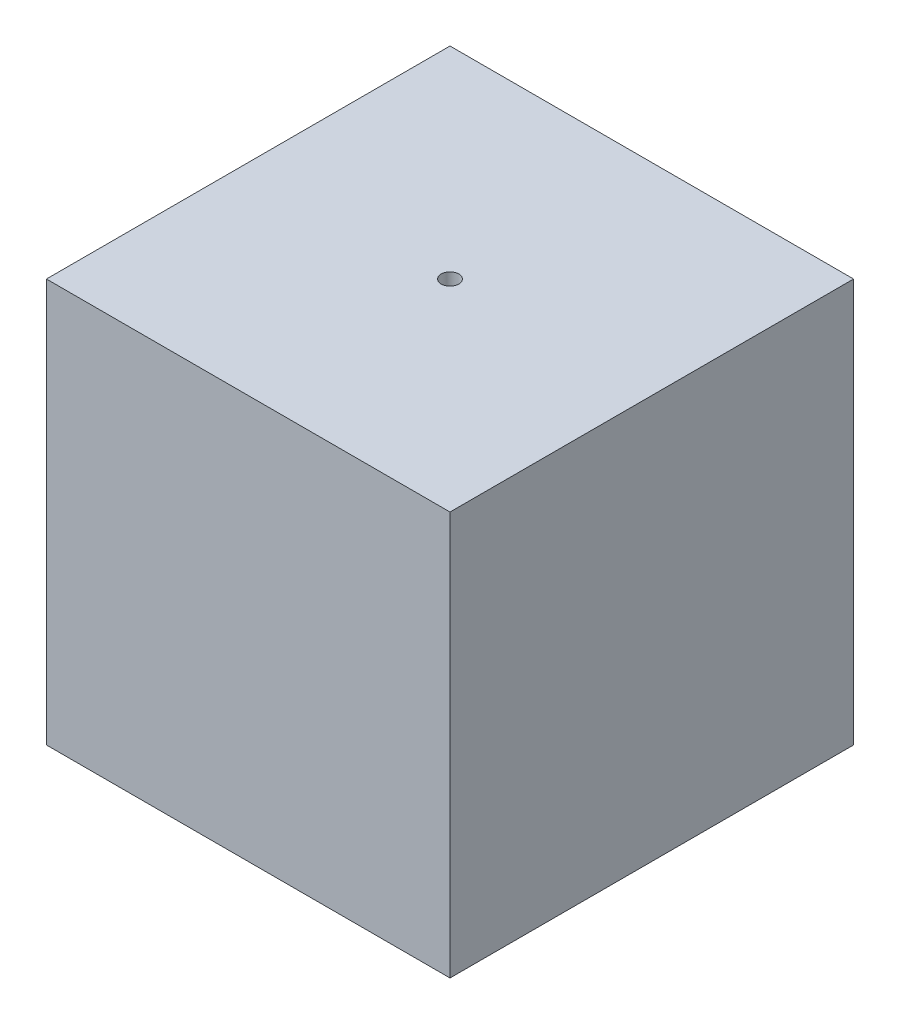
ISO-10303-21;
HEADER;
FILE_DESCRIPTION(('STEP AP214'),'2;1');
FILE_NAME('part.step','',(''),(''),'','','');
FILE_SCHEMA(('AUTOMOTIVE_DESIGN { 1 0 10303 214 1 1 1 1 }'));
ENDSEC;
DATA;
#1=APPLICATION_CONTEXT('core data for automotive mechanical design processes');
#2=APPLICATION_PROTOCOL_DEFINITION('international standard','automotive_design',2000,#1);
#3=PRODUCT_CONTEXT('',#1,'mechanical');
#4=PRODUCT('Part','Part','',(#3));
#5=PRODUCT_RELATED_PRODUCT_CATEGORY('part','',(#4));
#6=PRODUCT_DEFINITION_FORMATION('','',#4);
#7=PRODUCT_DEFINITION_CONTEXT('part definition',#1,'design');
#8=PRODUCT_DEFINITION('design','',#6,#7);
#9=PRODUCT_DEFINITION_SHAPE('','',#8);
#10=(LENGTH_UNIT() NAMED_UNIT(*) SI_UNIT(.MILLI.,.METRE.));
#11=(NAMED_UNIT(*) PLANE_ANGLE_UNIT() SI_UNIT($,.RADIAN.));
#12=(NAMED_UNIT(*) SI_UNIT($,.STERADIAN.) SOLID_ANGLE_UNIT());
#13=UNCERTAINTY_MEASURE_WITH_UNIT(LENGTH_MEASURE(1.E-05),#10,'distance_accuracy_value','');
#14=(GEOMETRIC_REPRESENTATION_CONTEXT(3) GLOBAL_UNCERTAINTY_ASSIGNED_CONTEXT((#13)) GLOBAL_UNIT_ASSIGNED_CONTEXT((#10,
#11,#12)) REPRESENTATION_CONTEXT('',''));
#15=CARTESIAN_POINT('',(0.,0.,0.));
#16=DIRECTION('',(0.,0.,1.));
#17=DIRECTION('',(1.,0.,0.));
#18=AXIS2_PLACEMENT_3D('',#15,#16,#17);
#19=CARTESIAN_POINT('',(0.,230.,0.));
#20=DIRECTION('',(1.,0.,0.));
#21=DIRECTION('',(0.,0.,-1.));
#22=AXIS2_PLACEMENT_3D('',#19,#20,#21);
#23=PLANE('',#22);
#24=DIRECTION('',(0.,0.,1.));
#25=VECTOR('',#24,1.);
#26=CARTESIAN_POINT('',(0.,0.,0.));
#27=LINE('',#26,#25);
#28=CARTESIAN_POINT('',(0.,0.,-230.));
#29=VERTEX_POINT('',#28);
#30=CARTESIAN_POINT('',(0.,0.,0.));
#31=VERTEX_POINT('',#30);
#32=EDGE_CURVE('E107',#29,#31,#27,.T.);
#33=ORIENTED_EDGE('',*,*,#32,.T.);
#34=DIRECTION('',(0.,-1.,0.));
#35=VECTOR('',#34,1.);
#36=CARTESIAN_POINT('',(0.,230.,0.));
#37=LINE('',#36,#35);
#38=CARTESIAN_POINT('',(0.,230.,0.));
#39=VERTEX_POINT('',#38);
#40=EDGE_CURVE('E11',#39,#31,#37,.T.);
#41=ORIENTED_EDGE('',*,*,#40,.F.);
#42=DIRECTION('',(0.,0.,1.));
#43=VECTOR('',#42,1.);
#44=CARTESIAN_POINT('',(0.,230.,0.));
#45=LINE('',#44,#43);
#46=CARTESIAN_POINT('',(0.,230.,-230.));
#47=VERTEX_POINT('',#46);
#48=EDGE_CURVE('E91',#47,#39,#45,.T.);
#49=ORIENTED_EDGE('',*,*,#48,.F.);
#50=DIRECTION('',(0.,-1.,0.));
#51=VECTOR('',#50,1.);
#52=CARTESIAN_POINT('',(0.,230.,-230.));
#53=LINE('',#52,#51);
#54=EDGE_CURVE('E103',#47,#29,#53,.T.);
#55=ORIENTED_EDGE('',*,*,#54,.T.);
#56=EDGE_LOOP('',(#33,#41,#49,#55));
#57=FACE_BOUND('',#56,.T.);
#58=ADVANCED_FACE('F39',(#57),#23,.F.);
#59=CARTESIAN_POINT('',(0.,230.,0.));
#60=DIRECTION('',(0.,0.,-1.));
#61=DIRECTION('',(-1.,0.,0.));
#62=AXIS2_PLACEMENT_3D('',#59,#60,#61);
#63=PLANE('',#62);
#64=DIRECTION('',(1.,0.,0.));
#65=VECTOR('',#64,1.);
#66=CARTESIAN_POINT('',(0.,0.,0.));
#67=LINE('',#66,#65);
#68=CARTESIAN_POINT('',(230.,0.,0.));
#69=VERTEX_POINT('',#68);
#70=EDGE_CURVE('E96',#31,#69,#67,.T.);
#71=ORIENTED_EDGE('',*,*,#70,.T.);
#72=DIRECTION('',(0.,-1.,0.));
#73=VECTOR('',#72,1.);
#74=CARTESIAN_POINT('',(230.,230.,0.));
#75=LINE('',#74,#73);
#76=CARTESIAN_POINT('',(230.,230.,0.));
#77=VERTEX_POINT('',#76);
#78=EDGE_CURVE('E48',#77,#69,#75,.T.);
#79=ORIENTED_EDGE('',*,*,#78,.F.);
#80=DIRECTION('',(1.,0.,0.));
#81=VECTOR('',#80,1.);
#82=CARTESIAN_POINT('',(0.,230.,0.));
#83=LINE('',#82,#81);
#84=EDGE_CURVE('E86',#39,#77,#83,.T.);
#85=ORIENTED_EDGE('',*,*,#84,.F.);
#86=ORIENTED_EDGE('',*,*,#40,.T.);
#87=EDGE_LOOP('',(#71,#79,#85,#86));
#88=FACE_BOUND('',#87,.T.);
#89=ADVANCED_FACE('F95',(#88),#63,.F.);
#90=CARTESIAN_POINT('',(230.,230.,0.));
#91=DIRECTION('',(-1.,0.,0.));
#92=DIRECTION('',(0.,0.,1.));
#93=AXIS2_PLACEMENT_3D('',#90,#91,#92);
#94=PLANE('',#93);
#95=DIRECTION('',(0.,0.,-1.));
#96=VECTOR('',#95,1.);
#97=CARTESIAN_POINT('',(230.,0.,0.));
#98=LINE('',#97,#96);
#99=CARTESIAN_POINT('',(230.,0.,-230.));
#100=VERTEX_POINT('',#99);
#101=EDGE_CURVE('E73',#69,#100,#98,.T.);
#102=ORIENTED_EDGE('',*,*,#101,.T.);
#103=DIRECTION('',(0.,-1.,0.));
#104=VECTOR('',#103,1.);
#105=CARTESIAN_POINT('',(230.,230.,-230.));
#106=LINE('',#105,#104);
#107=CARTESIAN_POINT('',(230.,230.,-230.));
#108=VERTEX_POINT('',#107);
#109=EDGE_CURVE('E98',#108,#100,#106,.T.);
#110=ORIENTED_EDGE('',*,*,#109,.F.);
#111=DIRECTION('',(0.,0.,-1.));
#112=VECTOR('',#111,1.);
#113=CARTESIAN_POINT('',(230.,230.,0.));
#114=LINE('',#113,#112);
#115=EDGE_CURVE('E89',#77,#108,#114,.T.);
#116=ORIENTED_EDGE('',*,*,#115,.F.);
#117=ORIENTED_EDGE('',*,*,#78,.T.);
#118=EDGE_LOOP('',(#102,#110,#116,#117));
#119=FACE_BOUND('',#118,.T.);
#120=ADVANCED_FACE('F99',(#119),#94,.F.);
#121=CARTESIAN_POINT('',(0.,230.,-230.));
#122=DIRECTION('',(0.,0.,1.));
#123=DIRECTION('',(1.,0.,0.));
#124=AXIS2_PLACEMENT_3D('',#121,#122,#123);
#125=PLANE('',#124);
#126=DIRECTION('',(-1.,0.,0.));
#127=VECTOR('',#126,1.);
#128=CARTESIAN_POINT('',(0.,0.,-230.));
#129=LINE('',#128,#127);
#130=EDGE_CURVE('E79',#100,#29,#129,.T.);
#131=ORIENTED_EDGE('',*,*,#130,.T.);
#132=ORIENTED_EDGE('',*,*,#54,.F.);
#133=DIRECTION('',(-1.,0.,0.));
#134=VECTOR('',#133,1.);
#135=CARTESIAN_POINT('',(0.,230.,-230.));
#136=LINE('',#135,#134);
#137=EDGE_CURVE('E56',#108,#47,#136,.T.);
#138=ORIENTED_EDGE('',*,*,#137,.F.);
#139=ORIENTED_EDGE('',*,*,#109,.T.);
#140=EDGE_LOOP('',(#131,#132,#138,#139));
#141=FACE_BOUND('',#140,.T.);
#142=ADVANCED_FACE('F121',(#141),#125,.F.);
#143=CARTESIAN_POINT('',(0.,230.,0.));
#144=DIRECTION('',(0.,-1.,0.));
#145=DIRECTION('',(0.,0.,-1.));
#146=AXIS2_PLACEMENT_3D('',#143,#144,#145);
#147=PLANE('',#146);
#148=CARTESIAN_POINT('',(115.,230.,-115.));
#149=DIRECTION('',(0.,1.,0.));
#150=DIRECTION('',(0.,0.,1.));
#151=AXIS2_PLACEMENT_3D('',#148,#149,#150);
#152=CIRCLE('',#151,5.00000000000001);
#153=CARTESIAN_POINT('',(115.,230.,-110.));
#154=VERTEX_POINT('',#153);
#155=EDGE_CURVE('E128',#154,#154,#152,.T.);
#156=ORIENTED_EDGE('',*,*,#155,.F.);
#157=EDGE_LOOP('',(#156));
#158=FACE_BOUND('',#157,.T.);
#159=ORIENTED_EDGE('',*,*,#48,.T.);
#160=ORIENTED_EDGE('',*,*,#84,.T.);
#161=ORIENTED_EDGE('',*,*,#115,.T.);
#162=ORIENTED_EDGE('',*,*,#137,.T.);
#163=EDGE_LOOP('',(#159,#160,#161,#162));
#164=FACE_BOUND('',#163,.T.);
#165=ADVANCED_FACE('F87',(#158,#164),#147,.F.);
#166=CARTESIAN_POINT('',(0.,0.,0.));
#167=DIRECTION('',(0.,-1.,0.));
#168=DIRECTION('',(0.,0.,-1.));
#169=AXIS2_PLACEMENT_3D('',#166,#167,#168);
#170=PLANE('',#169);
#171=ORIENTED_EDGE('',*,*,#32,.F.);
#172=ORIENTED_EDGE('',*,*,#130,.F.);
#173=ORIENTED_EDGE('',*,*,#101,.F.);
#174=ORIENTED_EDGE('',*,*,#70,.F.);
#175=EDGE_LOOP('',(#171,#172,#173,#174));
#176=FACE_BOUND('',#175,.T.);
#177=ADVANCED_FACE('F124',(#176),#170,.T.);
#178=CARTESIAN_POINT('',(115.,220.,-115.));
#179=DIRECTION('',(0.,1.,0.));
#180=DIRECTION('',(0.,0.,1.));
#181=AXIS2_PLACEMENT_3D('',#178,#179,#180);
#182=CYLINDRICAL_SURFACE('',#181,5.00000000000001);
#183=CARTESIAN_POINT('',(115.,220.,-115.));
#184=DIRECTION('',(0.,1.,0.));
#185=DIRECTION('',(0.,0.,1.));
#186=AXIS2_PLACEMENT_3D('',#183,#184,#185);
#187=CIRCLE('',#186,5.00000000000001);
#188=CARTESIAN_POINT('',(115.,220.,-110.));
#189=VERTEX_POINT('',#188);
#190=EDGE_CURVE('E111',#189,#189,#187,.T.);
#191=ORIENTED_EDGE('',*,*,#190,.F.);
#192=EDGE_LOOP('',(#191));
#193=FACE_BOUND('',#192,.T.);
#194=ORIENTED_EDGE('',*,*,#155,.T.);
#195=EDGE_LOOP('',(#194));
#196=FACE_BOUND('',#195,.T.);
#197=ADVANCED_FACE('F138',(#193,#196),#182,.F.);
#198=CARTESIAN_POINT('',(115.,220.,-115.));
#199=DIRECTION('',(0.,1.,0.));
#200=DIRECTION('',(0.,0.,1.));
#201=AXIS2_PLACEMENT_3D('',#198,#199,#200);
#202=PLANE('',#201);
#203=ORIENTED_EDGE('',*,*,#190,.T.);
#204=EDGE_LOOP('',(#203));
#205=FACE_BOUND('',#204,.T.);
#206=ADVANCED_FACE('F136',(#205),#202,.T.);
#207=CLOSED_SHELL('',(#58,#89,#120,#142,#165,#177,#197,#206));
#208=MANIFOLD_SOLID_BREP('B2',#207);
#209=ADVANCED_BREP_SHAPE_REPRESENTATION('',(#18,#208),#14);
#210=SHAPE_DEFINITION_REPRESENTATION(#9,#209);
ENDSEC;
END-ISO-10303-21;
